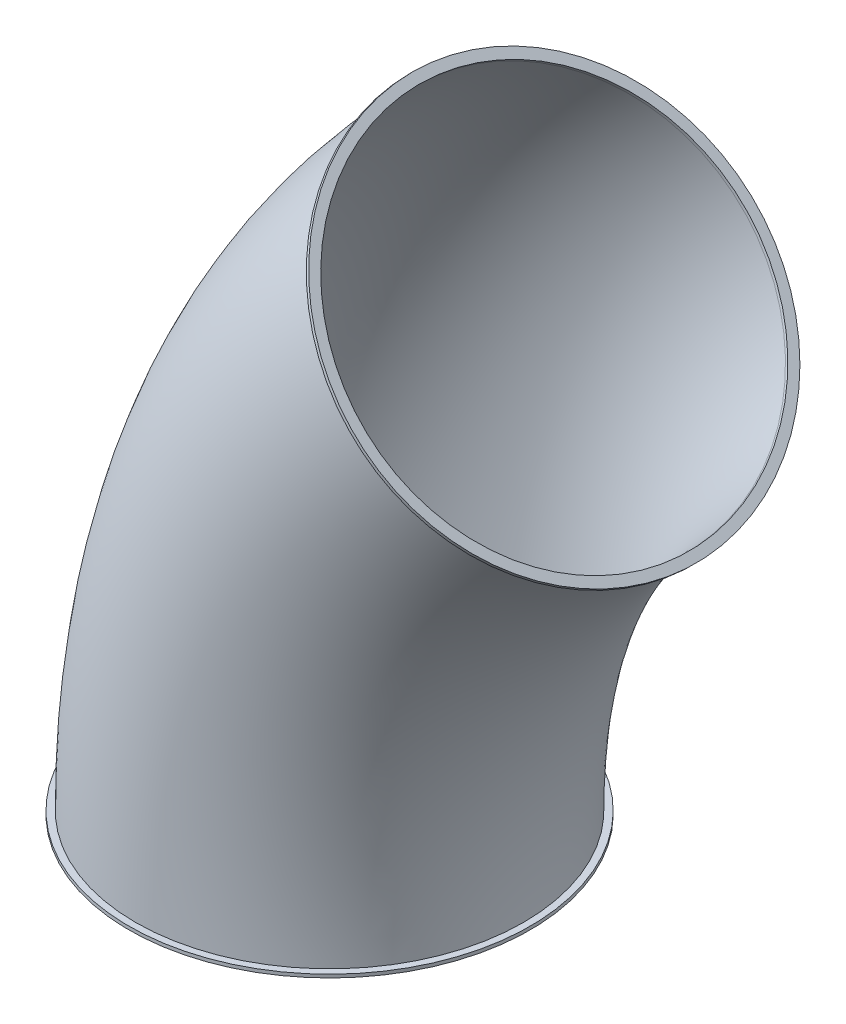
ISO-10303-21;
HEADER;
FILE_DESCRIPTION(('STEP AP214'),'2;1');
FILE_NAME('part.step','',(''),(''),'','','');
FILE_SCHEMA(('AUTOMOTIVE_DESIGN { 1 0 10303 214 1 1 1 1 }'));
ENDSEC;
DATA;
#1=APPLICATION_CONTEXT('core data for automotive mechanical design processes');
#2=APPLICATION_PROTOCOL_DEFINITION('international standard','automotive_design',2000,#1);
#3=PRODUCT_CONTEXT('',#1,'mechanical');
#4=PRODUCT('Part','Part','',(#3));
#5=PRODUCT_RELATED_PRODUCT_CATEGORY('part','',(#4));
#6=PRODUCT_DEFINITION_FORMATION('','',#4);
#7=PRODUCT_DEFINITION_CONTEXT('part definition',#1,'design');
#8=PRODUCT_DEFINITION('design','',#6,#7);
#9=PRODUCT_DEFINITION_SHAPE('','',#8);
#10=(LENGTH_UNIT() NAMED_UNIT(*) SI_UNIT(.MILLI.,.METRE.));
#11=(NAMED_UNIT(*) PLANE_ANGLE_UNIT() SI_UNIT($,.RADIAN.));
#12=(NAMED_UNIT(*) SI_UNIT($,.STERADIAN.) SOLID_ANGLE_UNIT());
#13=UNCERTAINTY_MEASURE_WITH_UNIT(LENGTH_MEASURE(1.E-05),#10,'distance_accuracy_value','');
#14=(GEOMETRIC_REPRESENTATION_CONTEXT(3) GLOBAL_UNCERTAINTY_ASSIGNED_CONTEXT((#13)) GLOBAL_UNIT_ASSIGNED_CONTEXT((#10,
#11,#12)) REPRESENTATION_CONTEXT('',''));
#15=CARTESIAN_POINT('',(0.,0.,0.));
#16=DIRECTION('',(0.,0.,1.));
#17=DIRECTION('',(1.,0.,0.));
#18=AXIS2_PLACEMENT_3D('',#15,#16,#17);
#19=CARTESIAN_POINT('',(-7.24264068711932,3.,0.));
#20=DIRECTION('',(0.,0.,-1.));
#21=DIRECTION('',(-1.,0.,0.));
#22=AXIS2_PLACEMENT_3D('',#19,#20,#21);
#23=TOROIDAL_SURFACE('',#22,692.757359312881,177.);
#24=CARTESIAN_POINT('',(-700.,3.,0.));
#25=DIRECTION('',(0.,-1.,0.));
#26=DIRECTION('',(1.,0.,0.));
#27=AXIS2_PLACEMENT_3D('',#24,#25,#26);
#28=CIRCLE('',#27,177.);
#29=CARTESIAN_POINT('',(-877.,3.,0.));
#30=VERTEX_POINT('',#29);
#31=EDGE_CURVE('E19',#30,#30,#28,.T.);
#32=ORIENTED_EDGE('',*,*,#31,.F.);
#33=EDGE_LOOP('',(#32));
#34=FACE_BOUND('',#33,.T.);
#35=CARTESIAN_POINT('',(-497.096067174143,492.853426487024,0.));
#36=DIRECTION('',(-0.707106781186547,-0.707106781186548,0.));
#37=DIRECTION('',(0.707106781186548,-0.707106781186547,0.));
#38=AXIS2_PLACEMENT_3D('',#35,#36,#37);
#39=CIRCLE('',#38,177.);
#40=CARTESIAN_POINT('',(-622.253967444162,618.011326757042,0.));
#41=VERTEX_POINT('',#40);
#42=EDGE_CURVE('E89',#41,#41,#39,.T.);
#43=ORIENTED_EDGE('',*,*,#42,.T.);
#44=EDGE_LOOP('',(#43));
#45=FACE_BOUND('',#44,.T.);
#46=ADVANCED_FACE('F15',(#34,#45),#23,.T.);
#47=CARTESIAN_POINT('',(-7.24264068711932,3.,0.));
#48=DIRECTION('',(0.,0.,-1.));
#49=DIRECTION('',(-1.,0.,0.));
#50=AXIS2_PLACEMENT_3D('',#47,#48,#49);
#51=TOROIDAL_SURFACE('',#50,692.757359312881,174.);
#52=CARTESIAN_POINT('',(-700.,3.,0.));
#53=DIRECTION('',(0.,1.,0.));
#54=DIRECTION('',(-1.,0.,0.));
#55=AXIS2_PLACEMENT_3D('',#52,#53,#54);
#56=CIRCLE('',#55,174.);
#57=CARTESIAN_POINT('',(-874.,3.,0.));
#58=VERTEX_POINT('',#57);
#59=EDGE_CURVE('E87',#58,#58,#56,.T.);
#60=ORIENTED_EDGE('',*,*,#59,.F.);
#61=EDGE_LOOP('',(#60));
#62=FACE_BOUND('',#61,.T.);
#63=CARTESIAN_POINT('',(-497.096067174143,492.853426487024,0.));
#64=DIRECTION('',(-0.707106781186547,-0.707106781186548,0.));
#65=DIRECTION('',(-0.707106781186548,0.707106781186547,0.));
#66=AXIS2_PLACEMENT_3D('',#63,#64,#65);
#67=CIRCLE('',#66,174.);
#68=CARTESIAN_POINT('',(-620.132647100602,615.890006413483,0.));
#69=VERTEX_POINT('',#68);
#70=EDGE_CURVE('E26',#69,#69,#67,.T.);
#71=ORIENTED_EDGE('',*,*,#70,.F.);
#72=EDGE_LOOP('',(#71));
#73=FACE_BOUND('',#72,.T.);
#74=ADVANCED_FACE('F17',(#62,#73),#51,.F.);
#75=CARTESIAN_POINT('',(-494.974746830583,494.974746830583,0.));
#76=DIRECTION('',(-0.707106781186547,-0.707106781186548,0.));
#77=DIRECTION('',(-0.707106781186548,0.707106781186547,0.));
#78=AXIS2_PLACEMENT_3D('',#75,#76,#77);
#79=PLANE('',#78);
#80=CARTESIAN_POINT('',(-494.974746830583,494.974746830583,0.));
#81=DIRECTION('',(-0.707106781186548,-0.707106781186547,0.));
#82=DIRECTION('',(0.707106781186547,-0.707106781186548,0.));
#83=AXIS2_PLACEMENT_3D('',#80,#81,#82);
#84=CIRCLE('',#83,174.);
#85=CARTESIAN_POINT('',(-618.011326757043,618.011326757042,0.));
#86=VERTEX_POINT('',#85);
#87=EDGE_CURVE('E91',#86,#86,#84,.T.);
#88=ORIENTED_EDGE('',*,*,#87,.T.);
#89=EDGE_LOOP('',(#88));
#90=FACE_BOUND('',#89,.T.);
#91=CARTESIAN_POINT('',(-494.974746830583,494.974746830583,0.));
#92=DIRECTION('',(-0.707106781186547,-0.707106781186548,0.));
#93=DIRECTION('',(0.707106781186548,-0.707106781186547,0.));
#94=AXIS2_PLACEMENT_3D('',#91,#92,#93);
#95=CIRCLE('',#94,183.);
#96=CARTESIAN_POINT('',(-624.375287787722,624.375287787721,0.));
#97=VERTEX_POINT('',#96);
#98=EDGE_CURVE('E10',#97,#97,#95,.T.);
#99=ORIENTED_EDGE('',*,*,#98,.F.);
#100=EDGE_LOOP('',(#99));
#101=FACE_BOUND('',#100,.T.);
#102=ADVANCED_FACE('F119',(#90,#101),#79,.F.);
#103=CARTESIAN_POINT('',(-497.096067174143,492.853426487024,0.));
#104=DIRECTION('',(0.707106781186548,0.707106781186548,0.));
#105=DIRECTION('',(0.707106781186548,-0.707106781186548,0.));
#106=AXIS2_PLACEMENT_3D('',#103,#104,#105);
#107=CYLINDRICAL_SURFACE('',#106,183.);
#108=CARTESIAN_POINT('',(-497.096067174143,492.853426487024,0.));
#109=DIRECTION('',(-0.707106781186547,-0.707106781186548,0.));
#110=DIRECTION('',(0.707106781186548,-0.707106781186547,0.));
#111=AXIS2_PLACEMENT_3D('',#108,#109,#110);
#112=CIRCLE('',#111,183.);
#113=CARTESIAN_POINT('',(-626.496608131281,622.253967444162,0.));
#114=VERTEX_POINT('',#113);
#115=EDGE_CURVE('E92',#114,#114,#112,.T.);
#116=ORIENTED_EDGE('',*,*,#115,.F.);
#117=EDGE_LOOP('',(#116));
#118=FACE_BOUND('',#117,.T.);
#119=ORIENTED_EDGE('',*,*,#98,.T.);
#120=EDGE_LOOP('',(#119));
#121=FACE_BOUND('',#120,.T.);
#122=ADVANCED_FACE('F126',(#118,#121),#107,.T.);
#123=CARTESIAN_POINT('',(-497.096067174143,492.853426487024,0.));
#124=DIRECTION('',(0.707106781186548,0.707106781186547,0.));
#125=DIRECTION('',(0.707106781186547,-0.707106781186548,0.));
#126=AXIS2_PLACEMENT_3D('',#123,#124,#125);
#127=CYLINDRICAL_SURFACE('',#126,174.);
#128=ORIENTED_EDGE('',*,*,#70,.T.);
#129=EDGE_LOOP('',(#128));
#130=FACE_BOUND('',#129,.T.);
#131=ORIENTED_EDGE('',*,*,#87,.F.);
#132=EDGE_LOOP('',(#131));
#133=FACE_BOUND('',#132,.T.);
#134=ADVANCED_FACE('F115',(#130,#133),#127,.F.);
#135=CARTESIAN_POINT('',(-497.096067174143,492.853426487024,0.));
#136=DIRECTION('',(-0.707106781186547,-0.707106781186548,0.));
#137=DIRECTION('',(-0.707106781186548,0.707106781186547,0.));
#138=AXIS2_PLACEMENT_3D('',#135,#136,#137);
#139=PLANE('',#138);
#140=ORIENTED_EDGE('',*,*,#42,.F.);
#141=EDGE_LOOP('',(#140));
#142=FACE_BOUND('',#141,.T.);
#143=ORIENTED_EDGE('',*,*,#115,.T.);
#144=EDGE_LOOP('',(#143));
#145=FACE_BOUND('',#144,.T.);
#146=ADVANCED_FACE('F156',(#142,#145),#139,.T.);
#147=CARTESIAN_POINT('',(-700.,0.,0.));
#148=DIRECTION('',(0.,-1.,0.));
#149=DIRECTION('',(0.,0.,-1.));
#150=AXIS2_PLACEMENT_3D('',#147,#148,#149);
#151=PLANE('',#150);
#152=CARTESIAN_POINT('',(-700.,0.,0.));
#153=DIRECTION('',(0.,1.,0.));
#154=DIRECTION('',(1.,0.,0.));
#155=AXIS2_PLACEMENT_3D('',#152,#153,#154);
#156=CIRCLE('',#155,174.);
#157=CARTESIAN_POINT('',(-874.,0.,0.));
#158=VERTEX_POINT('',#157);
#159=EDGE_CURVE('E85',#158,#158,#156,.T.);
#160=ORIENTED_EDGE('',*,*,#159,.T.);
#161=EDGE_LOOP('',(#160));
#162=FACE_BOUND('',#161,.T.);
#163=CARTESIAN_POINT('',(-700.,0.,0.));
#164=DIRECTION('',(0.,1.,0.));
#165=DIRECTION('',(1.,0.,0.));
#166=AXIS2_PLACEMENT_3D('',#163,#164,#165);
#167=CIRCLE('',#166,183.);
#168=CARTESIAN_POINT('',(-883.,0.,0.));
#169=VERTEX_POINT('',#168);
#170=EDGE_CURVE('E100',#169,#169,#167,.T.);
#171=ORIENTED_EDGE('',*,*,#170,.F.);
#172=EDGE_LOOP('',(#171));
#173=FACE_BOUND('',#172,.T.);
#174=ADVANCED_FACE('F212',(#162,#173),#151,.T.);
#175=CARTESIAN_POINT('',(-700.,3.,0.));
#176=DIRECTION('',(0.,-1.,0.));
#177=DIRECTION('',(1.,0.,0.));
#178=AXIS2_PLACEMENT_3D('',#175,#176,#177);
#179=CYLINDRICAL_SURFACE('',#178,183.);
#180=CARTESIAN_POINT('',(-700.,3.,0.));
#181=DIRECTION('',(0.,-1.,0.));
#182=DIRECTION('',(1.,0.,0.));
#183=AXIS2_PLACEMENT_3D('',#180,#181,#182);
#184=CIRCLE('',#183,183.);
#185=CARTESIAN_POINT('',(-883.,3.,0.));
#186=VERTEX_POINT('',#185);
#187=EDGE_CURVE('E75',#186,#186,#184,.T.);
#188=ORIENTED_EDGE('',*,*,#187,.T.);
#189=EDGE_LOOP('',(#188));
#190=FACE_BOUND('',#189,.T.);
#191=ORIENTED_EDGE('',*,*,#170,.T.);
#192=EDGE_LOOP('',(#191));
#193=FACE_BOUND('',#192,.T.);
#194=ADVANCED_FACE('F76',(#190,#193),#179,.T.);
#195=CARTESIAN_POINT('',(-700.,3.,0.));
#196=DIRECTION('',(0.,-1.,0.));
#197=DIRECTION('',(1.,0.,0.));
#198=AXIS2_PLACEMENT_3D('',#195,#196,#197);
#199=CYLINDRICAL_SURFACE('',#198,174.);
#200=ORIENTED_EDGE('',*,*,#59,.T.);
#201=EDGE_LOOP('',(#200));
#202=FACE_BOUND('',#201,.T.);
#203=ORIENTED_EDGE('',*,*,#159,.F.);
#204=EDGE_LOOP('',(#203));
#205=FACE_BOUND('',#204,.T.);
#206=ADVANCED_FACE('F180',(#202,#205),#199,.F.);
#207=CARTESIAN_POINT('',(-700.,3.,0.));
#208=DIRECTION('',(0.,-1.,0.));
#209=DIRECTION('',(0.,0.,-1.));
#210=AXIS2_PLACEMENT_3D('',#207,#208,#209);
#211=PLANE('',#210);
#212=ORIENTED_EDGE('',*,*,#31,.T.);
#213=EDGE_LOOP('',(#212));
#214=FACE_BOUND('',#213,.T.);
#215=ORIENTED_EDGE('',*,*,#187,.F.);
#216=EDGE_LOOP('',(#215));
#217=FACE_BOUND('',#216,.T.);
#218=ADVANCED_FACE('F175',(#214,#217),#211,.F.);
#219=CLOSED_SHELL('',(#46,#74,#102,#122,#134,#146,#174,#194,#206,#218));
#220=MANIFOLD_SOLID_BREP('B1',#219);
#221=ADVANCED_BREP_SHAPE_REPRESENTATION('',(#18,#220),#14);
#222=SHAPE_DEFINITION_REPRESENTATION(#9,#221);
ENDSEC;
END-ISO-10303-21;
